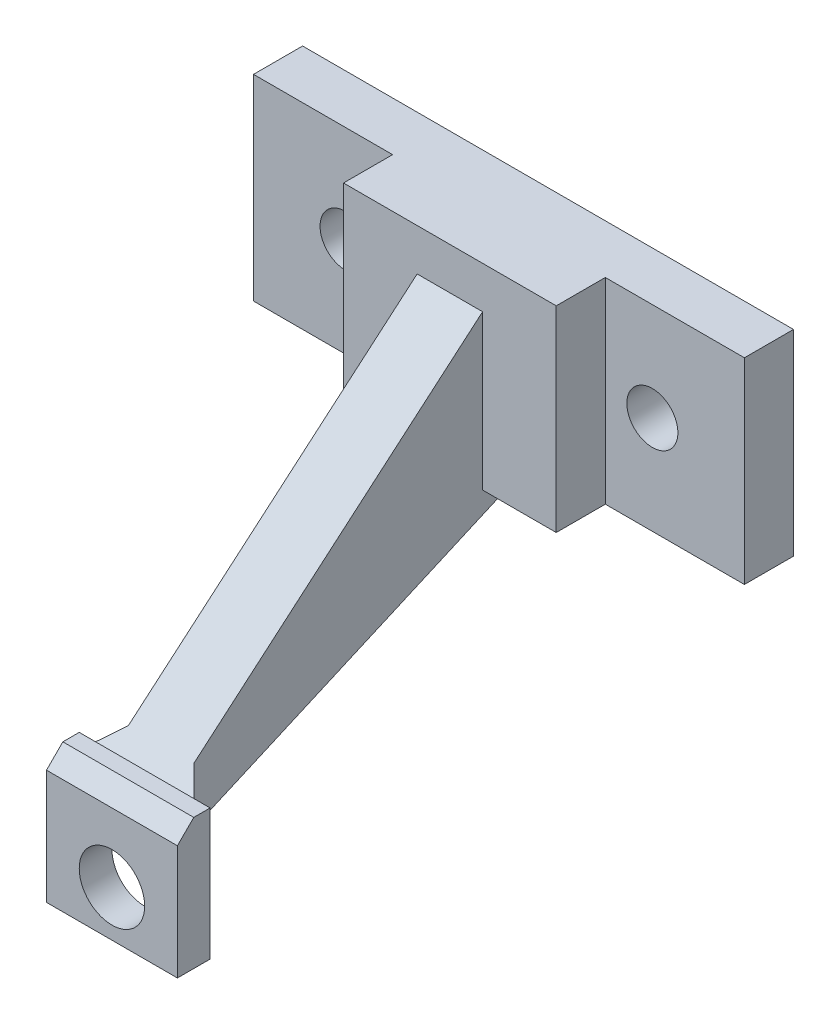
ISO-10303-21;
HEADER;
FILE_DESCRIPTION(('STEP AP214'),'2;1');
FILE_NAME('part.step','',(''),(''),'','','');
FILE_SCHEMA(('AUTOMOTIVE_DESIGN { 1 0 10303 214 1 1 1 1 }'));
ENDSEC;
DATA;
#1=APPLICATION_CONTEXT('core data for automotive mechanical design processes');
#2=APPLICATION_PROTOCOL_DEFINITION('international standard','automotive_design',2000,#1);
#3=PRODUCT_CONTEXT('',#1,'mechanical');
#4=PRODUCT('Part','Part','',(#3));
#5=PRODUCT_RELATED_PRODUCT_CATEGORY('part','',(#4));
#6=PRODUCT_DEFINITION_FORMATION('','',#4);
#7=PRODUCT_DEFINITION_CONTEXT('part definition',#1,'design');
#8=PRODUCT_DEFINITION('design','',#6,#7);
#9=PRODUCT_DEFINITION_SHAPE('','',#8);
#10=(LENGTH_UNIT() NAMED_UNIT(*) SI_UNIT(.MILLI.,.METRE.));
#11=(NAMED_UNIT(*) PLANE_ANGLE_UNIT() SI_UNIT($,.RADIAN.));
#12=(NAMED_UNIT(*) SI_UNIT($,.STERADIAN.) SOLID_ANGLE_UNIT());
#13=UNCERTAINTY_MEASURE_WITH_UNIT(LENGTH_MEASURE(1.E-05),#10,'distance_accuracy_value','');
#14=(GEOMETRIC_REPRESENTATION_CONTEXT(3) GLOBAL_UNCERTAINTY_ASSIGNED_CONTEXT((#13)) GLOBAL_UNIT_ASSIGNED_CONTEXT((#10,
#11,#12)) REPRESENTATION_CONTEXT('',''));
#15=CARTESIAN_POINT('',(0.,0.,0.));
#16=DIRECTION('',(0.,0.,1.));
#17=DIRECTION('',(1.,0.,0.));
#18=AXIS2_PLACEMENT_3D('',#15,#16,#17);
#19=CARTESIAN_POINT('',(0.,0.,3.));
#20=DIRECTION('',(0.,1.,0.));
#21=DIRECTION('',(0.,0.,1.));
#22=AXIS2_PLACEMENT_3D('',#19,#20,#21);
#23=PLANE('',#22);
#24=DIRECTION('',(0.,0.,-1.));
#25=VECTOR('',#24,1.);
#26=CARTESIAN_POINT('',(13.,0.,3.));
#27=LINE('',#26,#25);
#28=CARTESIAN_POINT('',(13.,0.,6.));
#29=VERTEX_POINT('',#28);
#30=CARTESIAN_POINT('',(13.,0.,3.));
#31=VERTEX_POINT('',#30);
#32=EDGE_CURVE('E254',#29,#31,#27,.T.);
#33=ORIENTED_EDGE('',*,*,#32,.F.);
#34=DIRECTION('',(1.,0.,0.));
#35=VECTOR('',#34,1.);
#36=CARTESIAN_POINT('',(8.49999999999999,0.,6.));
#37=LINE('',#36,#35);
#38=CARTESIAN_POINT('',(8.49999999999999,0.,6.));
#39=VERTEX_POINT('',#38);
#40=EDGE_CURVE('E271',#39,#29,#37,.T.);
#41=ORIENTED_EDGE('',*,*,#40,.F.);
#42=DIRECTION('',(0.,0.,-1.));
#43=VECTOR('',#42,1.);
#44=CARTESIAN_POINT('',(8.49999999999999,0.,6.));
#45=LINE('',#44,#43);
#46=CARTESIAN_POINT('',(8.49999999999999,0.,3.));
#47=VERTEX_POINT('',#46);
#48=EDGE_CURVE('E285',#39,#47,#45,.T.);
#49=ORIENTED_EDGE('',*,*,#48,.T.);
#50=DIRECTION('',(1.,0.,0.));
#51=VECTOR('',#50,1.);
#52=CARTESIAN_POINT('',(0.,0.,3.));
#53=LINE('',#52,#51);
#54=CARTESIAN_POINT('',(0.,0.,3.));
#55=VERTEX_POINT('',#54);
#56=EDGE_CURVE('E320',#55,#47,#53,.T.);
#57=ORIENTED_EDGE('',*,*,#56,.F.);
#58=DIRECTION('',(0.,0.,-1.));
#59=VECTOR('',#58,1.);
#60=CARTESIAN_POINT('',(0.,0.,3.));
#61=LINE('',#60,#59);
#62=CARTESIAN_POINT('',(0.,0.,0.));
#63=VERTEX_POINT('',#62);
#64=EDGE_CURVE('E353',#55,#63,#61,.T.);
#65=ORIENTED_EDGE('',*,*,#64,.T.);
#66=DIRECTION('',(1.,0.,0.));
#67=VECTOR('',#66,1.);
#68=CARTESIAN_POINT('',(0.,0.,0.));
#69=LINE('',#68,#67);
#70=CARTESIAN_POINT('',(30.,0.,0.));
#71=VERTEX_POINT('',#70);
#72=EDGE_CURVE('E334',#63,#71,#69,.T.);
#73=ORIENTED_EDGE('',*,*,#72,.T.);
#74=DIRECTION('',(0.,0.,-1.));
#75=VECTOR('',#74,1.);
#76=CARTESIAN_POINT('',(30.,0.,3.));
#77=LINE('',#76,#75);
#78=CARTESIAN_POINT('',(30.,0.,3.));
#79=VERTEX_POINT('',#78);
#80=EDGE_CURVE('E349',#79,#71,#77,.T.);
#81=ORIENTED_EDGE('',*,*,#80,.F.);
#82=CARTESIAN_POINT('',(21.5,0.,3.));
#83=VERTEX_POINT('',#82);
#84=EDGE_CURVE('E318',#83,#79,#53,.T.);
#85=ORIENTED_EDGE('',*,*,#84,.F.);
#86=DIRECTION('',(0.,0.,-1.));
#87=VECTOR('',#86,1.);
#88=CARTESIAN_POINT('',(21.5,0.,6.));
#89=LINE('',#88,#87);
#90=CARTESIAN_POINT('',(21.5,0.,6.));
#91=VERTEX_POINT('',#90);
#92=EDGE_CURVE('E275',#91,#83,#89,.T.);
#93=ORIENTED_EDGE('',*,*,#92,.F.);
#94=CARTESIAN_POINT('',(17.,0.,6.));
#95=VERTEX_POINT('',#94);
#96=EDGE_CURVE('E270',#95,#91,#37,.T.);
#97=ORIENTED_EDGE('',*,*,#96,.F.);
#98=DIRECTION('',(0.,0.,-1.));
#99=VECTOR('',#98,1.);
#100=CARTESIAN_POINT('',(17.,0.,3.));
#101=LINE('',#100,#99);
#102=CARTESIAN_POINT('',(17.,0.,3.));
#103=VERTEX_POINT('',#102);
#104=EDGE_CURVE('E248',#95,#103,#101,.T.);
#105=ORIENTED_EDGE('',*,*,#104,.T.);
#106=DIRECTION('',(1.,0.,0.));
#107=VECTOR('',#106,1.);
#108=CARTESIAN_POINT('',(13.,0.,3.));
#109=LINE('',#108,#107);
#110=EDGE_CURVE('E244',#31,#103,#109,.T.);
#111=ORIENTED_EDGE('',*,*,#110,.F.);
#112=EDGE_LOOP('',(#33,#41,#49,#57,#65,#73,#81,#85,#93,#97,#105,#111));
#113=FACE_BOUND('',#112,.T.);
#114=ADVANCED_FACE('F47',(#113),#23,.F.);
#115=CARTESIAN_POINT('',(0.,0.,6.));
#116=DIRECTION('',(0.,0.,1.));
#117=DIRECTION('',(1.,0.,0.));
#118=AXIS2_PLACEMENT_3D('',#115,#116,#117);
#119=PLANE('',#118);
#120=ORIENTED_EDGE('',*,*,#40,.T.);
#121=DIRECTION('',(0.,1.,0.));
#122=VECTOR('',#121,1.);
#123=CARTESIAN_POINT('',(13.,0.,6.));
#124=LINE('',#123,#122);
#125=CARTESIAN_POINT('',(13.,9.43656480479761,6.));
#126=VERTEX_POINT('',#125);
#127=EDGE_CURVE('E365',#29,#126,#124,.T.);
#128=ORIENTED_EDGE('',*,*,#127,.T.);
#129=DIRECTION('',(-1.,0.,0.));
#130=VECTOR('',#129,1.);
#131=CARTESIAN_POINT('',(0.,9.43656480479761,6.));
#132=LINE('',#131,#130);
#133=CARTESIAN_POINT('',(17.,9.43656480479761,6.));
#134=VERTEX_POINT('',#133);
#135=EDGE_CURVE('E361',#134,#126,#132,.T.);
#136=ORIENTED_EDGE('',*,*,#135,.F.);
#137=DIRECTION('',(0.,1.,0.));
#138=VECTOR('',#137,1.);
#139=CARTESIAN_POINT('',(17.,0.,6.));
#140=LINE('',#139,#138);
#141=EDGE_CURVE('E357',#95,#134,#140,.T.);
#142=ORIENTED_EDGE('',*,*,#141,.F.);
#143=ORIENTED_EDGE('',*,*,#96,.T.);
#144=DIRECTION('',(0.,1.,0.));
#145=VECTOR('',#144,1.);
#146=CARTESIAN_POINT('',(21.5,12.,6.));
#147=LINE('',#146,#145);
#148=CARTESIAN_POINT('',(21.5,12.,6.));
#149=VERTEX_POINT('',#148);
#150=EDGE_CURVE('E259',#91,#149,#147,.T.);
#151=ORIENTED_EDGE('',*,*,#150,.T.);
#152=DIRECTION('',(-1.,0.,0.));
#153=VECTOR('',#152,1.);
#154=CARTESIAN_POINT('',(8.49999999999999,12.,6.));
#155=LINE('',#154,#153);
#156=CARTESIAN_POINT('',(8.49999999999999,12.,6.));
#157=VERTEX_POINT('',#156);
#158=EDGE_CURVE('E263',#149,#157,#155,.T.);
#159=ORIENTED_EDGE('',*,*,#158,.T.);
#160=DIRECTION('',(0.,-1.,0.));
#161=VECTOR('',#160,1.);
#162=CARTESIAN_POINT('',(8.49999999999999,12.,6.));
#163=LINE('',#162,#161);
#164=EDGE_CURVE('E267',#157,#39,#163,.T.);
#165=ORIENTED_EDGE('',*,*,#164,.T.);
#166=EDGE_LOOP('',(#120,#128,#136,#142,#143,#151,#159,#165));
#167=FACE_BOUND('',#166,.T.);
#168=ADVANCED_FACE('F427',(#167),#119,.T.);
#169=CARTESIAN_POINT('',(0.,0.,3.));
#170=DIRECTION('',(0.,0.,-1.));
#171=DIRECTION('',(-1.,0.,0.));
#172=AXIS2_PLACEMENT_3D('',#169,#170,#171);
#173=PLANE('',#172);
#174=CARTESIAN_POINT('',(24.375,6.,3.));
#175=DIRECTION('',(0.,0.,1.));
#176=DIRECTION('',(1.,0.,0.));
#177=AXIS2_PLACEMENT_3D('',#174,#175,#176);
#178=CIRCLE('',#177,1.56);
#179=CARTESIAN_POINT('',(25.935,6.,3.));
#180=VERTEX_POINT('',#179);
#181=EDGE_CURVE('E298',#180,#180,#178,.T.);
#182=ORIENTED_EDGE('',*,*,#181,.F.);
#183=EDGE_LOOP('',(#182));
#184=FACE_BOUND('',#183,.T.);
#185=DIRECTION('',(0.,1.,0.));
#186=VECTOR('',#185,1.);
#187=CARTESIAN_POINT('',(21.5,12.,3.));
#188=LINE('',#187,#186);
#189=CARTESIAN_POINT('',(21.5,12.,3.));
#190=VERTEX_POINT('',#189);
#191=EDGE_CURVE('E258',#83,#190,#188,.T.);
#192=ORIENTED_EDGE('',*,*,#191,.F.);
#193=ORIENTED_EDGE('',*,*,#84,.T.);
#194=DIRECTION('',(0.,1.,0.));
#195=VECTOR('',#194,1.);
#196=CARTESIAN_POINT('',(30.,0.,3.));
#197=LINE('',#196,#195);
#198=CARTESIAN_POINT('',(30.,12.,3.));
#199=VERTEX_POINT('',#198);
#200=EDGE_CURVE('E323',#79,#199,#197,.T.);
#201=ORIENTED_EDGE('',*,*,#200,.T.);
#202=DIRECTION('',(-1.,0.,0.));
#203=VECTOR('',#202,1.);
#204=CARTESIAN_POINT('',(0.,12.,3.));
#205=LINE('',#204,#203);
#206=EDGE_CURVE('E327',#199,#190,#205,.T.);
#207=ORIENTED_EDGE('',*,*,#206,.T.);
#208=EDGE_LOOP('',(#192,#193,#201,#207));
#209=FACE_BOUND('',#208,.T.);
#210=ADVANCED_FACE('F531',(#184,#209),#173,.F.);
#211=CARTESIAN_POINT('',(5.625,6.,3.));
#212=DIRECTION('',(0.,0.,1.));
#213=DIRECTION('',(1.,0.,0.));
#214=AXIS2_PLACEMENT_3D('',#211,#212,#213);
#215=CIRCLE('',#214,1.56);
#216=CARTESIAN_POINT('',(7.185,6.,3.));
#217=VERTEX_POINT('',#216);
#218=EDGE_CURVE('E306',#217,#217,#215,.T.);
#219=ORIENTED_EDGE('',*,*,#218,.F.);
#220=EDGE_LOOP('',(#219));
#221=FACE_BOUND('',#220,.T.);
#222=DIRECTION('',(0.,-1.,0.));
#223=VECTOR('',#222,1.);
#224=CARTESIAN_POINT('',(8.49999999999999,12.,3.));
#225=LINE('',#224,#223);
#226=CARTESIAN_POINT('',(8.49999999999999,12.,3.));
#227=VERTEX_POINT('',#226);
#228=EDGE_CURVE('E264',#227,#47,#225,.T.);
#229=ORIENTED_EDGE('',*,*,#228,.F.);
#230=CARTESIAN_POINT('',(0.,12.,3.));
#231=VERTEX_POINT('',#230);
#232=EDGE_CURVE('E326',#227,#231,#205,.T.);
#233=ORIENTED_EDGE('',*,*,#232,.T.);
#234=DIRECTION('',(0.,-1.,0.));
#235=VECTOR('',#234,1.);
#236=CARTESIAN_POINT('',(0.,0.,3.));
#237=LINE('',#236,#235);
#238=EDGE_CURVE('E314',#231,#55,#237,.T.);
#239=ORIENTED_EDGE('',*,*,#238,.T.);
#240=ORIENTED_EDGE('',*,*,#56,.T.);
#241=EDGE_LOOP('',(#229,#233,#239,#240));
#242=FACE_BOUND('',#241,.T.);
#243=ADVANCED_FACE('F593',(#221,#242),#173,.F.);
#244=CARTESIAN_POINT('',(0.,0.,0.));
#245=DIRECTION('',(0.,0.,-1.));
#246=DIRECTION('',(-1.,0.,0.));
#247=AXIS2_PLACEMENT_3D('',#244,#245,#246);
#248=PLANE('',#247);
#249=CARTESIAN_POINT('',(5.625,6.,0.));
#250=DIRECTION('',(0.,0.,1.));
#251=DIRECTION('',(1.,0.,0.));
#252=AXIS2_PLACEMENT_3D('',#249,#250,#251);
#253=CIRCLE('',#252,1.56);
#254=CARTESIAN_POINT('',(7.185,6.,0.));
#255=VERTEX_POINT('',#254);
#256=EDGE_CURVE('E302',#255,#255,#253,.T.);
#257=ORIENTED_EDGE('',*,*,#256,.T.);
#258=EDGE_LOOP('',(#257));
#259=FACE_BOUND('',#258,.T.);
#260=DIRECTION('',(0.,-1.,0.));
#261=VECTOR('',#260,1.);
#262=CARTESIAN_POINT('',(0.,0.,0.));
#263=LINE('',#262,#261);
#264=CARTESIAN_POINT('',(0.,12.,0.));
#265=VERTEX_POINT('',#264);
#266=EDGE_CURVE('E310',#265,#63,#263,.T.);
#267=ORIENTED_EDGE('',*,*,#266,.F.);
#268=DIRECTION('',(-1.,0.,0.));
#269=VECTOR('',#268,1.);
#270=CARTESIAN_POINT('',(0.,12.,0.));
#271=LINE('',#270,#269);
#272=CARTESIAN_POINT('',(30.,12.,0.));
#273=VERTEX_POINT('',#272);
#274=EDGE_CURVE('E319',#273,#265,#271,.T.);
#275=ORIENTED_EDGE('',*,*,#274,.F.);
#276=DIRECTION('',(0.,1.,0.));
#277=VECTOR('',#276,1.);
#278=CARTESIAN_POINT('',(30.,0.,0.));
#279=LINE('',#278,#277);
#280=EDGE_CURVE('E337',#71,#273,#279,.T.);
#281=ORIENTED_EDGE('',*,*,#280,.F.);
#282=ORIENTED_EDGE('',*,*,#72,.F.);
#283=EDGE_LOOP('',(#267,#275,#281,#282));
#284=FACE_BOUND('',#283,.T.);
#285=CARTESIAN_POINT('',(24.375,6.,0.));
#286=DIRECTION('',(0.,0.,1.));
#287=DIRECTION('',(1.,0.,0.));
#288=AXIS2_PLACEMENT_3D('',#285,#286,#287);
#289=CIRCLE('',#288,1.56);
#290=CARTESIAN_POINT('',(25.935,6.,0.));
#291=VERTEX_POINT('',#290);
#292=EDGE_CURVE('E297',#291,#291,#289,.T.);
#293=ORIENTED_EDGE('',*,*,#292,.T.);
#294=EDGE_LOOP('',(#293));
#295=FACE_BOUND('',#294,.T.);
#296=ADVANCED_FACE('F539',(#259,#284,#295),#248,.T.);
#297=CARTESIAN_POINT('',(0.,0.,3.));
#298=DIRECTION('',(1.,0.,0.));
#299=DIRECTION('',(0.,1.,0.));
#300=AXIS2_PLACEMENT_3D('',#297,#298,#299);
#301=PLANE('',#300);
#302=ORIENTED_EDGE('',*,*,#266,.T.);
#303=ORIENTED_EDGE('',*,*,#64,.F.);
#304=ORIENTED_EDGE('',*,*,#238,.F.);
#305=DIRECTION('',(0.,0.,-1.));
#306=VECTOR('',#305,1.);
#307=CARTESIAN_POINT('',(0.,12.,3.));
#308=LINE('',#307,#306);
#309=EDGE_CURVE('E330',#231,#265,#308,.T.);
#310=ORIENTED_EDGE('',*,*,#309,.T.);
#311=EDGE_LOOP('',(#302,#303,#304,#310));
#312=FACE_BOUND('',#311,.T.);
#313=ADVANCED_FACE('F537',(#312),#301,.F.);
#314=CARTESIAN_POINT('',(30.,0.,3.));
#315=DIRECTION('',(-1.,0.,0.));
#316=DIRECTION('',(0.,0.,1.));
#317=AXIS2_PLACEMENT_3D('',#314,#315,#316);
#318=PLANE('',#317);
#319=ORIENTED_EDGE('',*,*,#280,.T.);
#320=DIRECTION('',(0.,0.,-1.));
#321=VECTOR('',#320,1.);
#322=CARTESIAN_POINT('',(30.,12.,3.));
#323=LINE('',#322,#321);
#324=EDGE_CURVE('E345',#199,#273,#323,.T.);
#325=ORIENTED_EDGE('',*,*,#324,.F.);
#326=ORIENTED_EDGE('',*,*,#200,.F.);
#327=ORIENTED_EDGE('',*,*,#80,.T.);
#328=EDGE_LOOP('',(#319,#325,#326,#327));
#329=FACE_BOUND('',#328,.T.);
#330=ADVANCED_FACE('F535',(#329),#318,.F.);
#331=CARTESIAN_POINT('',(0.,12.,3.));
#332=DIRECTION('',(0.,-1.,0.));
#333=DIRECTION('',(0.,0.,-1.));
#334=AXIS2_PLACEMENT_3D('',#331,#332,#333);
#335=PLANE('',#334);
#336=ORIENTED_EDGE('',*,*,#274,.T.);
#337=ORIENTED_EDGE('',*,*,#309,.F.);
#338=ORIENTED_EDGE('',*,*,#232,.F.);
#339=DIRECTION('',(0.,0.,-1.));
#340=VECTOR('',#339,1.);
#341=CARTESIAN_POINT('',(8.49999999999999,12.,6.));
#342=LINE('',#341,#340);
#343=EDGE_CURVE('E289',#157,#227,#342,.T.);
#344=ORIENTED_EDGE('',*,*,#343,.F.);
#345=ORIENTED_EDGE('',*,*,#158,.F.);
#346=DIRECTION('',(0.,0.,-1.));
#347=VECTOR('',#346,1.);
#348=CARTESIAN_POINT('',(21.5,12.,6.));
#349=LINE('',#348,#347);
#350=EDGE_CURVE('E293',#149,#190,#349,.T.);
#351=ORIENTED_EDGE('',*,*,#350,.T.);
#352=ORIENTED_EDGE('',*,*,#206,.F.);
#353=ORIENTED_EDGE('',*,*,#324,.T.);
#354=EDGE_LOOP('',(#336,#337,#338,#344,#345,#351,#352,#353));
#355=FACE_BOUND('',#354,.T.);
#356=ADVANCED_FACE('F438',(#355),#335,.F.);
#357=CARTESIAN_POINT('',(5.625,6.,3.));
#358=DIRECTION('',(0.,0.,-1.));
#359=DIRECTION('',(-1.,0.,0.));
#360=AXIS2_PLACEMENT_3D('',#357,#358,#359);
#361=CYLINDRICAL_SURFACE('',#360,1.56);
#362=ORIENTED_EDGE('',*,*,#218,.T.);
#363=EDGE_LOOP('',(#362));
#364=FACE_BOUND('',#363,.T.);
#365=ORIENTED_EDGE('',*,*,#256,.F.);
#366=EDGE_LOOP('',(#365));
#367=FACE_BOUND('',#366,.T.);
#368=ADVANCED_FACE('F586',(#364,#367),#361,.F.);
#369=CARTESIAN_POINT('',(24.375,6.,3.));
#370=DIRECTION('',(0.,0.,-1.));
#371=DIRECTION('',(-1.,0.,0.));
#372=AXIS2_PLACEMENT_3D('',#369,#370,#371);
#373=CYLINDRICAL_SURFACE('',#372,1.56);
#374=ORIENTED_EDGE('',*,*,#181,.T.);
#375=EDGE_LOOP('',(#374));
#376=FACE_BOUND('',#375,.T.);
#377=ORIENTED_EDGE('',*,*,#292,.F.);
#378=EDGE_LOOP('',(#377));
#379=FACE_BOUND('',#378,.T.);
#380=ADVANCED_FACE('F583',(#376,#379),#373,.F.);
#381=CARTESIAN_POINT('',(21.5,12.,6.));
#382=DIRECTION('',(-1.,0.,0.));
#383=DIRECTION('',(0.,0.,1.));
#384=AXIS2_PLACEMENT_3D('',#381,#382,#383);
#385=PLANE('',#384);
#386=ORIENTED_EDGE('',*,*,#191,.T.);
#387=ORIENTED_EDGE('',*,*,#350,.F.);
#388=ORIENTED_EDGE('',*,*,#150,.F.);
#389=ORIENTED_EDGE('',*,*,#92,.T.);
#390=EDGE_LOOP('',(#386,#387,#388,#389));
#391=FACE_BOUND('',#390,.T.);
#392=ADVANCED_FACE('F435',(#391),#385,.F.);
#393=CARTESIAN_POINT('',(8.49999999999999,12.,6.));
#394=DIRECTION('',(1.,0.,0.));
#395=DIRECTION('',(0.,1.,0.));
#396=AXIS2_PLACEMENT_3D('',#393,#394,#395);
#397=PLANE('',#396);
#398=ORIENTED_EDGE('',*,*,#228,.T.);
#399=ORIENTED_EDGE('',*,*,#48,.F.);
#400=ORIENTED_EDGE('',*,*,#164,.F.);
#401=ORIENTED_EDGE('',*,*,#343,.T.);
#402=EDGE_LOOP('',(#398,#399,#400,#401));
#403=FACE_BOUND('',#402,.T.);
#404=ADVANCED_FACE('F446',(#403),#397,.F.);
#405=CARTESIAN_POINT('',(13.,0.,0.));
#406=DIRECTION('',(1.,0.,0.));
#407=DIRECTION('',(0.,0.,-1.));
#408=AXIS2_PLACEMENT_3D('',#405,#406,#407);
#409=PLANE('',#408);
#410=DIRECTION('',(0.,0.40180718771602,-0.915724294697778));
#411=VECTOR('',#410,1.);
#412=CARTESIAN_POINT('',(13.,0.,3.));
#413=LINE('',#412,#411);
#414=CARTESIAN_POINT('',(13.,-9.06121379541794,23.6506350946097));
#415=VERTEX_POINT('',#414);
#416=EDGE_CURVE('E240',#415,#31,#413,.T.);
#417=ORIENTED_EDGE('',*,*,#416,.F.);
#418=DIRECTION('',(0.,1.,0.));
#419=VECTOR('',#418,1.);
#420=CARTESIAN_POINT('',(13.,0.,23.6506350946097));
#421=LINE('',#420,#419);
#422=CARTESIAN_POINT('',(13.,-5.64552160160139,23.6506350946097));
#423=VERTEX_POINT('',#422);
#424=EDGE_CURVE('E388',#415,#423,#421,.T.);
#425=ORIENTED_EDGE('',*,*,#424,.T.);
#426=DIRECTION('',(0.,-0.649622863179143,0.760256624854353));
#427=VECTOR('',#426,1.);
#428=CARTESIAN_POINT('',(13.,12.,3.));
#429=LINE('',#428,#427);
#430=EDGE_CURVE('E236',#126,#423,#429,.T.);
#431=ORIENTED_EDGE('',*,*,#430,.F.);
#432=ORIENTED_EDGE('',*,*,#127,.F.);
#433=ORIENTED_EDGE('',*,*,#32,.T.);
#434=EDGE_LOOP('',(#417,#425,#431,#432,#433));
#435=FACE_BOUND('',#434,.T.);
#436=ADVANCED_FACE('F450',(#435),#409,.F.);
#437=CARTESIAN_POINT('',(17.,0.,0.));
#438=DIRECTION('',(1.,0.,0.));
#439=DIRECTION('',(0.,0.,-1.));
#440=AXIS2_PLACEMENT_3D('',#437,#438,#439);
#441=PLANE('',#440);
#442=DIRECTION('',(0.,-0.649622863179143,0.760256624854353));
#443=VECTOR('',#442,1.);
#444=CARTESIAN_POINT('',(17.,12.,3.));
#445=LINE('',#444,#443);
#446=CARTESIAN_POINT('',(17.,-5.64552160160138,23.6506350946097));
#447=VERTEX_POINT('',#446);
#448=EDGE_CURVE('E223',#134,#447,#445,.T.);
#449=ORIENTED_EDGE('',*,*,#448,.T.);
#450=DIRECTION('',(0.,-1.,0.));
#451=VECTOR('',#450,1.);
#452=CARTESIAN_POINT('',(17.,-9.50000000000218,23.6506350946097));
#453=LINE('',#452,#451);
#454=CARTESIAN_POINT('',(17.,-9.06121379541794,23.6506350946097));
#455=VERTEX_POINT('',#454);
#456=EDGE_CURVE('E368',#447,#455,#453,.T.);
#457=ORIENTED_EDGE('',*,*,#456,.T.);
#458=DIRECTION('',(0.,0.40180718771602,-0.915724294697778));
#459=VECTOR('',#458,1.);
#460=CARTESIAN_POINT('',(17.,0.,3.));
#461=LINE('',#460,#459);
#462=EDGE_CURVE('E228',#455,#103,#461,.T.);
#463=ORIENTED_EDGE('',*,*,#462,.T.);
#464=ORIENTED_EDGE('',*,*,#104,.F.);
#465=ORIENTED_EDGE('',*,*,#141,.T.);
#466=EDGE_LOOP('',(#449,#457,#463,#464,#465));
#467=FACE_BOUND('',#466,.T.);
#468=ADVANCED_FACE('F460',(#467),#441,.T.);
#469=CARTESIAN_POINT('',(13.,0.,3.));
#470=DIRECTION('',(0.,-0.915724294697778,-0.40180718771602));
#471=DIRECTION('',(0.,0.40180718771602,-0.915724294697778));
#472=AXIS2_PLACEMENT_3D('',#469,#470,#471);
#473=PLANE('',#472);
#474=DIRECTION('',(-0.675346879706953,0.296332894124426,-0.675346879706958));
#475=VECTOR('',#474,1.);
#476=CARTESIAN_POINT('',(15.1866019778258,-8.26551975986756,21.8372370724355));
#477=LINE('',#476,#475);
#478=CARTESIAN_POINT('',(17.0842757053022,-9.09819281228615,23.7349107999119));
#479=VERTEX_POINT('',#478);
#480=EDGE_CURVE('E391',#455,#479,#477,.F.);
#481=ORIENTED_EDGE('',*,*,#480,.T.);
#482=DIRECTION('',(-1.,0.,0.));
#483=VECTOR('',#482,1.);
#484=CARTESIAN_POINT('',(13.,-9.09819281228615,23.7349107999119));
#485=LINE('',#484,#483);
#486=CARTESIAN_POINT('',(12.9157242946978,-9.09819281228615,23.7349107999119));
#487=VERTEX_POINT('',#486);
#488=EDGE_CURVE('E385',#479,#487,#485,.T.);
#489=ORIENTED_EDGE('',*,*,#488,.T.);
#490=DIRECTION('',(0.675346879706958,0.296332894124424,-0.675346879706953));
#491=VECTOR('',#490,1.);
#492=CARTESIAN_POINT('',(13.9012112063143,-8.66577475067049,22.7494238882954));
#493=LINE('',#492,#491);
#494=EDGE_CURVE('E401',#487,#415,#493,.T.);
#495=ORIENTED_EDGE('',*,*,#494,.T.);
#496=ORIENTED_EDGE('',*,*,#416,.T.);
#497=ORIENTED_EDGE('',*,*,#110,.T.);
#498=ORIENTED_EDGE('',*,*,#462,.F.);
#499=EDGE_LOOP('',(#481,#489,#495,#496,#497,#498));
#500=FACE_BOUND('',#499,.T.);
#501=ADVANCED_FACE('F467',(#500),#473,.T.);
#502=CARTESIAN_POINT('',(13.,12.,3.));
#503=DIRECTION('',(0.,0.760256624854353,0.649622863179143));
#504=DIRECTION('',(0.,-0.649622863179143,0.760256624854353));
#505=AXIS2_PLACEMENT_3D('',#502,#503,#504);
#506=PLANE('',#505);
#507=ORIENTED_EDGE('',*,*,#448,.F.);
#508=ORIENTED_EDGE('',*,*,#135,.T.);
#509=ORIENTED_EDGE('',*,*,#430,.T.);
#510=DIRECTION('',(-0.605212753539007,-0.517141224335743,0.605212753539003));
#511=VECTOR('',#510,1.);
#512=CARTESIAN_POINT('',(14.0343730182677,-4.76167220160303,22.616262076342));
#513=LINE('',#512,#511);
#514=CARTESIAN_POINT('',(12.,-6.50000000000218,24.6506350946097));
#515=VERTEX_POINT('',#514);
#516=EDGE_CURVE('E404',#423,#515,#513,.T.);
#517=ORIENTED_EDGE('',*,*,#516,.T.);
#518=DIRECTION('',(1.,0.,0.));
#519=VECTOR('',#518,1.);
#520=CARTESIAN_POINT('',(13.,-6.50000000000218,24.6506350946097));
#521=LINE('',#520,#519);
#522=CARTESIAN_POINT('',(18.,-6.50000000000218,24.6506350946097));
#523=VERTEX_POINT('',#522);
#524=EDGE_CURVE('E243',#515,#523,#521,.T.);
#525=ORIENTED_EDGE('',*,*,#524,.T.);
#526=DIRECTION('',(0.605212753539002,-0.517141224335746,0.605212753539006));
#527=VECTOR('',#526,1.);
#528=CARTESIAN_POINT('',(15.2330620276398,-4.13571127290548,21.8836971222495));
#529=LINE('',#528,#527);
#530=EDGE_CURVE('E395',#523,#447,#529,.F.);
#531=ORIENTED_EDGE('',*,*,#530,.T.);
#532=EDGE_LOOP('',(#507,#508,#509,#517,#525,#531));
#533=FACE_BOUND('',#532,.T.);
#534=ADVANCED_FACE('F455',(#533),#506,.T.);
#535=CARTESIAN_POINT('',(0.,0.,24.6506350946097));
#536=DIRECTION('',(0.,0.,-1.));
#537=DIRECTION('',(-1.,0.,0.));
#538=AXIS2_PLACEMENT_3D('',#535,#536,#537);
#539=PLANE('',#538);
#540=DIRECTION('',(1.,0.,0.));
#541=VECTOR('',#540,1.);
#542=CARTESIAN_POINT('',(17.,-11.4458390982043,24.6506350946097));
#543=LINE('',#542,#541);
#544=CARTESIAN_POINT('',(16.9837848260326,-11.4458390982043,24.6506350946097));
#545=VERTEX_POINT('',#544);
#546=CARTESIAN_POINT('',(18.,-11.4458390982043,24.6506350946097));
#547=VERTEX_POINT('',#546);
#548=EDGE_CURVE('E378',#545,#547,#543,.T.);
#549=ORIENTED_EDGE('',*,*,#548,.T.);
#550=DIRECTION('',(0.,1.,0.));
#551=VECTOR('',#550,1.);
#552=CARTESIAN_POINT('',(18.,-6.50000000000218,24.6506350946097));
#553=LINE('',#552,#551);
#554=EDGE_CURVE('E381',#547,#523,#553,.T.);
#555=ORIENTED_EDGE('',*,*,#554,.T.);
#556=DIRECTION('',(-1.,0.,0.));
#557=VECTOR('',#556,1.);
#558=CARTESIAN_POINT('',(19.,-6.50000000000218,24.6506350946097));
#559=LINE('',#558,#557);
#560=CARTESIAN_POINT('',(19.,-6.50000000000218,24.6506350946097));
#561=VERTEX_POINT('',#560);
#562=EDGE_CURVE('E206',#561,#523,#559,.T.);
#563=ORIENTED_EDGE('',*,*,#562,.F.);
#564=DIRECTION('',(0.,1.,0.));
#565=VECTOR('',#564,1.);
#566=CARTESIAN_POINT('',(19.,-6.50000000000218,24.6506350946097));
#567=LINE('',#566,#565);
#568=CARTESIAN_POINT('',(19.,-14.5000000000022,24.6506350946097));
#569=VERTEX_POINT('',#568);
#570=EDGE_CURVE('E500',#569,#561,#567,.T.);
#571=ORIENTED_EDGE('',*,*,#570,.F.);
#572=DIRECTION('',(1.,0.,0.));
#573=VECTOR('',#572,1.);
#574=CARTESIAN_POINT('',(19.,-14.5000000000022,24.6506350946097));
#575=LINE('',#574,#573);
#576=CARTESIAN_POINT('',(11.,-14.5000000000022,24.6506350946097));
#577=VERTEX_POINT('',#576);
#578=EDGE_CURVE('E497',#577,#569,#575,.T.);
#579=ORIENTED_EDGE('',*,*,#578,.F.);
#580=DIRECTION('',(0.,-1.,0.));
#581=VECTOR('',#580,1.);
#582=CARTESIAN_POINT('',(11.,-6.50000000000218,24.6506350946097));
#583=LINE('',#582,#581);
#584=CARTESIAN_POINT('',(11.,-6.50000000000218,24.6506350946097));
#585=VERTEX_POINT('',#584);
#586=EDGE_CURVE('E221',#585,#577,#583,.T.);
#587=ORIENTED_EDGE('',*,*,#586,.F.);
#588=EDGE_CURVE('E504',#515,#585,#559,.T.);
#589=ORIENTED_EDGE('',*,*,#588,.F.);
#590=DIRECTION('',(0.,-1.,0.));
#591=VECTOR('',#590,1.);
#592=CARTESIAN_POINT('',(12.,0.,24.6506350946097));
#593=LINE('',#592,#591);
#594=CARTESIAN_POINT('',(12.,-11.4458390982043,24.6506350946097));
#595=VERTEX_POINT('',#594);
#596=EDGE_CURVE('E372',#515,#595,#593,.T.);
#597=ORIENTED_EDGE('',*,*,#596,.T.);
#598=DIRECTION('',(1.,0.,0.));
#599=VECTOR('',#598,1.);
#600=CARTESIAN_POINT('',(17.,-11.4458390982043,24.6506350946097));
#601=LINE('',#600,#599);
#602=CARTESIAN_POINT('',(13.0162151739674,-11.4458390982043,24.6506350946097));
#603=VERTEX_POINT('',#602);
#604=EDGE_CURVE('E375',#595,#603,#601,.T.);
#605=ORIENTED_EDGE('',*,*,#604,.T.);
#606=CARTESIAN_POINT('',(15.,-11.7000000000022,24.6506350946097));
#607=DIRECTION('',(0.,0.,1.));
#608=DIRECTION('',(1.,0.,0.));
#609=AXIS2_PLACEMENT_3D('',#606,#607,#608);
#610=CIRCLE('',#609,2.);
#611=EDGE_CURVE('E416',#603,#545,#610,.T.);
#612=ORIENTED_EDGE('',*,*,#611,.T.);
#613=EDGE_LOOP('',(#549,#555,#563,#571,#579,#587,#589,#597,#605,#612));
#614=FACE_BOUND('',#613,.T.);
#615=ADVANCED_FACE('F481',(#614),#539,.T.);
#616=CARTESIAN_POINT('',(0.,0.,26.6506350946097));
#617=DIRECTION('',(0.,0.,-1.));
#618=DIRECTION('',(-1.,0.,0.));
#619=AXIS2_PLACEMENT_3D('',#616,#617,#618);
#620=PLANE('',#619);
#621=DIRECTION('',(0.,1.,0.));
#622=VECTOR('',#621,1.);
#623=CARTESIAN_POINT('',(19.,-6.50000000000218,26.6506350946097));
#624=LINE('',#623,#622);
#625=CARTESIAN_POINT('',(19.,-14.5000000000022,26.6506350946097));
#626=VERTEX_POINT('',#625);
#627=CARTESIAN_POINT('',(19.,-7.50000000000219,26.6506350946097));
#628=VERTEX_POINT('',#627);
#629=EDGE_CURVE('E217',#626,#628,#624,.T.);
#630=ORIENTED_EDGE('',*,*,#629,.T.);
#631=DIRECTION('',(-1.,0.,0.));
#632=VECTOR('',#631,1.);
#633=CARTESIAN_POINT('',(0.,-7.50000000000219,26.6506350946097));
#634=LINE('',#633,#632);
#635=CARTESIAN_POINT('',(11.,-7.50000000000219,26.6506350946097));
#636=VERTEX_POINT('',#635);
#637=EDGE_CURVE('E203',#628,#636,#634,.T.);
#638=ORIENTED_EDGE('',*,*,#637,.T.);
#639=DIRECTION('',(0.,-1.,0.));
#640=VECTOR('',#639,1.);
#641=CARTESIAN_POINT('',(11.,-6.50000000000218,26.6506350946097));
#642=LINE('',#641,#640);
#643=CARTESIAN_POINT('',(11.,-14.5000000000022,26.6506350946097));
#644=VERTEX_POINT('',#643);
#645=EDGE_CURVE('E195',#636,#644,#642,.T.);
#646=ORIENTED_EDGE('',*,*,#645,.T.);
#647=DIRECTION('',(1.,0.,0.));
#648=VECTOR('',#647,1.);
#649=CARTESIAN_POINT('',(19.,-14.5000000000022,26.6506350946097));
#650=LINE('',#649,#648);
#651=EDGE_CURVE('E200',#644,#626,#650,.T.);
#652=ORIENTED_EDGE('',*,*,#651,.T.);
#653=EDGE_LOOP('',(#630,#638,#646,#652));
#654=FACE_BOUND('',#653,.T.);
#655=CARTESIAN_POINT('',(15.,-11.7000000000022,26.6506350946097));
#656=DIRECTION('',(0.,0.,1.));
#657=DIRECTION('',(1.,0.,0.));
#658=AXIS2_PLACEMENT_3D('',#655,#656,#657);
#659=CIRCLE('',#658,2.);
#660=CARTESIAN_POINT('',(17.,-11.7000000000022,26.6506350946097));
#661=VERTEX_POINT('',#660);
#662=EDGE_CURVE('E486',#661,#661,#659,.T.);
#663=ORIENTED_EDGE('',*,*,#662,.F.);
#664=EDGE_LOOP('',(#663));
#665=FACE_BOUND('',#664,.T.);
#666=ADVANCED_FACE('F198',(#654,#665),#620,.F.);
#667=CARTESIAN_POINT('',(11.,-6.50000000000218,26.6506350946097));
#668=DIRECTION('',(1.,0.,0.));
#669=DIRECTION('',(0.,1.,0.));
#670=AXIS2_PLACEMENT_3D('',#667,#668,#669);
#671=PLANE('',#670);
#672=ORIENTED_EDGE('',*,*,#645,.F.);
#673=DIRECTION('',(0.,-0.707106781186548,0.707106781186548));
#674=VECTOR('',#673,1.);
#675=CARTESIAN_POINT('',(11.,-7.50000000000219,26.6506350946097));
#676=LINE('',#675,#674);
#677=CARTESIAN_POINT('',(11.,-6.50000000000218,25.6506350946097));
#678=VERTEX_POINT('',#677);
#679=EDGE_CURVE('E71',#636,#678,#676,.F.);
#680=ORIENTED_EDGE('',*,*,#679,.T.);
#681=DIRECTION('',(0.,0.,-1.));
#682=VECTOR('',#681,1.);
#683=CARTESIAN_POINT('',(11.,-6.50000000000218,26.6506350946097));
#684=LINE('',#683,#682);
#685=EDGE_CURVE('E494',#678,#585,#684,.T.);
#686=ORIENTED_EDGE('',*,*,#685,.T.);
#687=ORIENTED_EDGE('',*,*,#586,.T.);
#688=DIRECTION('',(0.,0.,-1.));
#689=VECTOR('',#688,1.);
#690=CARTESIAN_POINT('',(11.,-14.5000000000022,26.6506350946097));
#691=LINE('',#690,#689);
#692=EDGE_CURVE('E211',#644,#577,#691,.T.);
#693=ORIENTED_EDGE('',*,*,#692,.F.);
#694=EDGE_LOOP('',(#672,#680,#686,#687,#693));
#695=FACE_BOUND('',#694,.T.);
#696=ADVANCED_FACE('F219',(#695),#671,.F.);
#697=CARTESIAN_POINT('',(19.,-14.5000000000022,26.6506350946097));
#698=DIRECTION('',(0.,1.,0.));
#699=DIRECTION('',(0.,0.,1.));
#700=AXIS2_PLACEMENT_3D('',#697,#698,#699);
#701=PLANE('',#700);
#702=ORIENTED_EDGE('',*,*,#578,.T.);
#703=DIRECTION('',(0.,0.,-1.));
#704=VECTOR('',#703,1.);
#705=CARTESIAN_POINT('',(19.,-14.5000000000022,26.6506350946097));
#706=LINE('',#705,#704);
#707=EDGE_CURVE('E214',#626,#569,#706,.T.);
#708=ORIENTED_EDGE('',*,*,#707,.F.);
#709=ORIENTED_EDGE('',*,*,#651,.F.);
#710=ORIENTED_EDGE('',*,*,#692,.T.);
#711=EDGE_LOOP('',(#702,#708,#709,#710));
#712=FACE_BOUND('',#711,.T.);
#713=ADVANCED_FACE('F210',(#712),#701,.F.);
#714=CARTESIAN_POINT('',(19.,-6.50000000000218,26.6506350946097));
#715=DIRECTION('',(-1.,0.,0.));
#716=DIRECTION('',(0.,-1.,0.));
#717=AXIS2_PLACEMENT_3D('',#714,#715,#716);
#718=PLANE('',#717);
#719=DIRECTION('',(0.,0.,-1.));
#720=VECTOR('',#719,1.);
#721=CARTESIAN_POINT('',(19.,-6.50000000000218,26.6506350946097));
#722=LINE('',#721,#720);
#723=CARTESIAN_POINT('',(19.,-6.50000000000218,25.6506350946097));
#724=VERTEX_POINT('',#723);
#725=EDGE_CURVE('E230',#724,#561,#722,.T.);
#726=ORIENTED_EDGE('',*,*,#725,.F.);
#727=DIRECTION('',(0.,0.707106781186548,-0.707106781186548));
#728=VECTOR('',#727,1.);
#729=CARTESIAN_POINT('',(19.,-7.5000000000022,26.6506350946097));
#730=LINE('',#729,#728);
#731=EDGE_CURVE('E11',#724,#628,#730,.F.);
#732=ORIENTED_EDGE('',*,*,#731,.T.);
#733=ORIENTED_EDGE('',*,*,#629,.F.);
#734=ORIENTED_EDGE('',*,*,#707,.T.);
#735=ORIENTED_EDGE('',*,*,#570,.T.);
#736=EDGE_LOOP('',(#726,#732,#733,#734,#735));
#737=FACE_BOUND('',#736,.T.);
#738=ADVANCED_FACE('F515',(#737),#718,.F.);
#739=CARTESIAN_POINT('',(19.,-6.50000000000218,26.6506350946097));
#740=DIRECTION('',(0.,-1.,0.));
#741=DIRECTION('',(0.,0.,-1.));
#742=AXIS2_PLACEMENT_3D('',#739,#740,#741);
#743=PLANE('',#742);
#744=ORIENTED_EDGE('',*,*,#685,.F.);
#745=DIRECTION('',(1.,0.,0.));
#746=VECTOR('',#745,1.);
#747=CARTESIAN_POINT('',(19.,-6.50000000000218,25.6506350946097));
#748=LINE('',#747,#746);
#749=EDGE_CURVE('E57',#678,#724,#748,.T.);
#750=ORIENTED_EDGE('',*,*,#749,.T.);
#751=ORIENTED_EDGE('',*,*,#725,.T.);
#752=ORIENTED_EDGE('',*,*,#562,.T.);
#753=ORIENTED_EDGE('',*,*,#524,.F.);
#754=ORIENTED_EDGE('',*,*,#588,.T.);
#755=EDGE_LOOP('',(#744,#750,#751,#752,#753,#754));
#756=FACE_BOUND('',#755,.T.);
#757=ADVANCED_FACE('F510',(#756),#743,.F.);
#758=CARTESIAN_POINT('',(15.,-11.7000000000022,26.6506350946097));
#759=DIRECTION('',(0.,0.,-1.));
#760=DIRECTION('',(-1.,0.,0.));
#761=AXIS2_PLACEMENT_3D('',#758,#759,#760);
#762=CYLINDRICAL_SURFACE('',#761,2.);
#763=ORIENTED_EDGE('',*,*,#662,.T.);
#764=EDGE_LOOP('',(#763));
#765=FACE_BOUND('',#764,.T.);
#766=ORIENTED_EDGE('',*,*,#611,.F.);
#767=CARTESIAN_POINT('',(15.,-11.7000000000022,24.7497732458443));
#768=DIRECTION('',(0.,-0.36339427131457,-0.931635445641563));
#769=DIRECTION('',(0.,0.931635445641563,-0.36339427131457));
#770=AXIS2_PLACEMENT_3D('',#767,#768,#769);
#771=ELLIPSE('',#770,2.14676245880997,2.);
#772=EDGE_CURVE('E398',#603,#545,#771,.T.);
#773=ORIENTED_EDGE('',*,*,#772,.T.);
#774=EDGE_LOOP('',(#766,#773));
#775=FACE_BOUND('',#774,.T.);
#776=ADVANCED_FACE('F484',(#765,#775),#762,.F.);
#777=CARTESIAN_POINT('',(12.,0.,24.6506350946097));
#778=DIRECTION('',(0.707106781186545,0.,0.70710678118655));
#779=DIRECTION('',(0.,-1.,0.));
#780=AXIS2_PLACEMENT_3D('',#777,#778,#779);
#781=PLANE('',#780);
#782=ORIENTED_EDGE('',*,*,#424,.F.);
#783=ORIENTED_EDGE('',*,*,#494,.F.);
#784=DIRECTION('',(0.341542094182848,0.875612925785356,-0.341542094182845));
#785=VECTOR('',#784,1.);
#786=CARTESIAN_POINT('',(15.4229774448273,-2.67033720133442,21.2276576497824));
#787=LINE('',#786,#785);
#788=EDGE_CURVE('E412',#595,#487,#787,.T.);
#789=ORIENTED_EDGE('',*,*,#788,.F.);
#790=ORIENTED_EDGE('',*,*,#596,.F.);
#791=ORIENTED_EDGE('',*,*,#516,.F.);
#792=EDGE_LOOP('',(#782,#783,#789,#790,#791));
#793=FACE_BOUND('',#792,.T.);
#794=ADVANCED_FACE('F471',(#793),#781,.F.);
#795=CARTESIAN_POINT('',(0.,-11.4458390982043,24.6506350946097));
#796=DIRECTION('',(0.,-0.36339427131457,-0.931635445641563));
#797=DIRECTION('',(-1.,0.,0.));
#798=AXIS2_PLACEMENT_3D('',#795,#796,#797);
#799=PLANE('',#798);
#800=ORIENTED_EDGE('',*,*,#488,.F.);
#801=DIRECTION('',(0.341542094182844,-0.875612925785357,0.341542094182846));
#802=VECTOR('',#801,1.);
#803=CARTESIAN_POINT('',(15.9002819622215,-6.06278299561094,22.5509170568312));
#804=LINE('',#803,#802);
#805=EDGE_CURVE('E408',#547,#479,#804,.F.);
#806=ORIENTED_EDGE('',*,*,#805,.F.);
#807=ORIENTED_EDGE('',*,*,#548,.F.);
#808=ORIENTED_EDGE('',*,*,#772,.F.);
#809=ORIENTED_EDGE('',*,*,#604,.F.);
#810=ORIENTED_EDGE('',*,*,#788,.T.);
#811=EDGE_LOOP('',(#800,#806,#807,#808,#809,#810));
#812=FACE_BOUND('',#811,.T.);
#813=ADVANCED_FACE('F475',(#812),#799,.T.);
#814=CARTESIAN_POINT('',(17.,0.,23.6506350946097));
#815=DIRECTION('',(0.70710678118655,0.,-0.707106781186545));
#816=DIRECTION('',(0.,1.,0.));
#817=AXIS2_PLACEMENT_3D('',#814,#815,#816);
#818=PLANE('',#817);
#819=ORIENTED_EDGE('',*,*,#530,.F.);
#820=ORIENTED_EDGE('',*,*,#554,.F.);
#821=ORIENTED_EDGE('',*,*,#805,.T.);
#822=ORIENTED_EDGE('',*,*,#480,.F.);
#823=ORIENTED_EDGE('',*,*,#456,.F.);
#824=EDGE_LOOP('',(#819,#820,#821,#822,#823));
#825=FACE_BOUND('',#824,.T.);
#826=ADVANCED_FACE('F463',(#825),#818,.T.);
#827=CARTESIAN_POINT('',(0.,-7.50000000000219,26.6506350946097));
#828=DIRECTION('',(0.,-0.707106781186547,-0.707106781186547));
#829=DIRECTION('',(-1.,0.,0.));
#830=AXIS2_PLACEMENT_3D('',#827,#828,#829);
#831=PLANE('',#830);
#832=ORIENTED_EDGE('',*,*,#731,.F.);
#833=ORIENTED_EDGE('',*,*,#749,.F.);
#834=ORIENTED_EDGE('',*,*,#679,.F.);
#835=ORIENTED_EDGE('',*,*,#637,.F.);
#836=EDGE_LOOP('',(#832,#833,#834,#835));
#837=FACE_BOUND('',#836,.T.);
#838=ADVANCED_FACE('F50',(#837),#831,.F.);
#839=CLOSED_SHELL('',(#114,#168,#210,#243,#296,#313,#330,#356,#368,#380,#392,#404,#436,#468,
#501,#534,#615,#666,#696,#713,#738,#757,#776,#794,#813,#826,#838));
#840=MANIFOLD_SOLID_BREP('B2',#839);
#841=ADVANCED_BREP_SHAPE_REPRESENTATION('',(#18,#840),#14);
#842=SHAPE_DEFINITION_REPRESENTATION(#9,#841);
ENDSEC;
END-ISO-10303-21;
